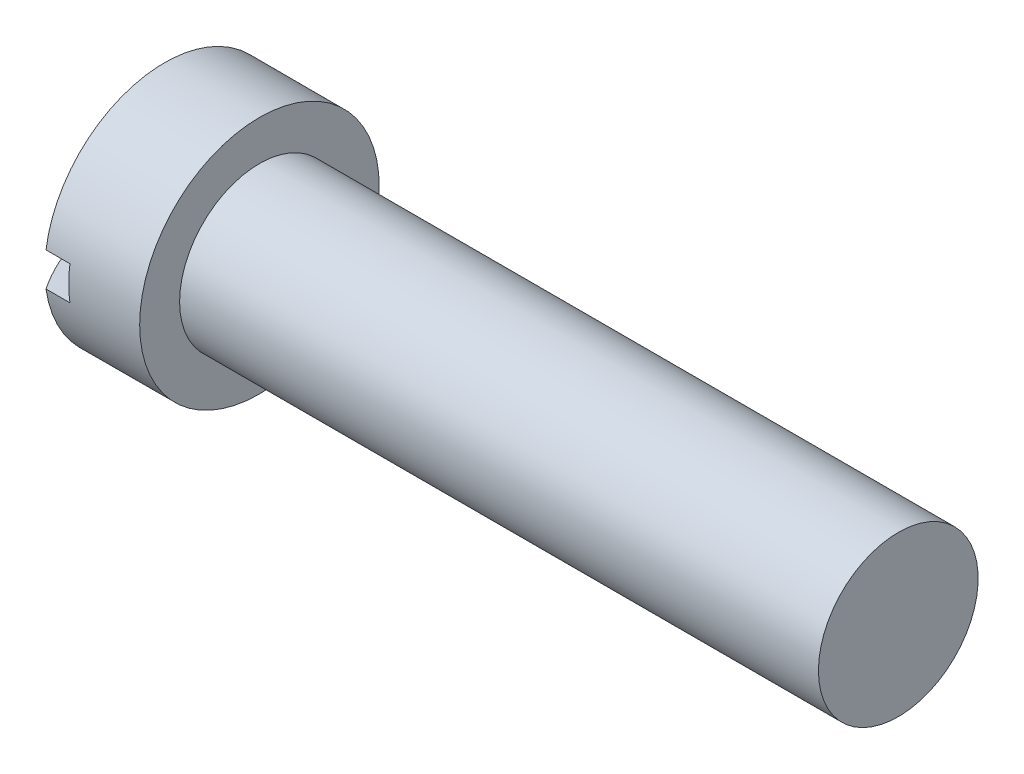
ISO-10303-21;
HEADER;
FILE_DESCRIPTION(('STEP AP214'),'2;1');
FILE_NAME('part.step','',(''),(''),'','','');
FILE_SCHEMA(('AUTOMOTIVE_DESIGN { 1 0 10303 214 1 1 1 1 }'));
ENDSEC;
DATA;
#1=APPLICATION_CONTEXT('core data for automotive mechanical design processes');
#2=APPLICATION_PROTOCOL_DEFINITION('international standard','automotive_design',2000,#1);
#3=PRODUCT_CONTEXT('',#1,'mechanical');
#4=PRODUCT('Part','Part','',(#3));
#5=PRODUCT_RELATED_PRODUCT_CATEGORY('part','',(#4));
#6=PRODUCT_DEFINITION_FORMATION('','',#4);
#7=PRODUCT_DEFINITION_CONTEXT('part definition',#1,'design');
#8=PRODUCT_DEFINITION('design','',#6,#7);
#9=PRODUCT_DEFINITION_SHAPE('','',#8);
#10=(LENGTH_UNIT() NAMED_UNIT(*) SI_UNIT(.MILLI.,.METRE.));
#11=(NAMED_UNIT(*) PLANE_ANGLE_UNIT() SI_UNIT($,.RADIAN.));
#12=(NAMED_UNIT(*) SI_UNIT($,.STERADIAN.) SOLID_ANGLE_UNIT());
#13=UNCERTAINTY_MEASURE_WITH_UNIT(LENGTH_MEASURE(1.E-05),#10,'distance_accuracy_value','');
#14=(GEOMETRIC_REPRESENTATION_CONTEXT(3) GLOBAL_UNCERTAINTY_ASSIGNED_CONTEXT((#13)) GLOBAL_UNIT_ASSIGNED_CONTEXT((#10,
#11,#12)) REPRESENTATION_CONTEXT('',''));
#15=CARTESIAN_POINT('',(0.,0.,0.));
#16=DIRECTION('',(0.,0.,1.));
#17=DIRECTION('',(1.,0.,0.));
#18=AXIS2_PLACEMENT_3D('',#15,#16,#17);
#19=CARTESIAN_POINT('',(16.9903913043478,0.,0.));
#20=DIRECTION('',(-1.,0.,0.));
#21=DIRECTION('',(0.,-1.,0.));
#22=AXIS2_PLACEMENT_3D('',#19,#20,#21);
#23=SPHERICAL_SURFACE('',#22,16.9903913043478);
#24=CARTESIAN_POINT('',(2.921,0.,0.));
#25=DIRECTION('',(-1.,0.,0.));
#26=DIRECTION('',(0.,0.,1.));
#27=AXIS2_PLACEMENT_3D('',#24,#25,#26);
#28=CIRCLE('',#27,9.525);
#29=CARTESIAN_POINT('',(2.921,-1.3462,-9.42938866311067));
#30=VERTEX_POINT('',#29);
#31=CARTESIAN_POINT('',(2.921,-1.3462,9.42938866311067));
#32=VERTEX_POINT('',#31);
#33=EDGE_CURVE('E98',#30,#32,#28,.T.);
#34=ORIENTED_EDGE('',*,*,#33,.T.);
#35=CARTESIAN_POINT('',(16.9903913043478,-1.3462,0.));
#36=DIRECTION('',(0.,1.,0.));
#37=DIRECTION('',(0.,0.,1.));
#38=AXIS2_PLACEMENT_3D('',#35,#36,#37);
#39=CIRCLE('',#38,16.9369755929109);
#40=EDGE_CURVE('E122',#32,#30,#39,.F.);
#41=ORIENTED_EDGE('',*,*,#40,.T.);
#42=EDGE_LOOP('',(#34,#41));
#43=FACE_BOUND('',#42,.T.);
#44=ADVANCED_FACE('F44',(#43),#23,.T.);
#45=CARTESIAN_POINT('',(2.921,1.3462,9.42938866311067));
#46=VERTEX_POINT('',#45);
#47=CARTESIAN_POINT('',(2.921,1.3462,-9.42938866311067));
#48=VERTEX_POINT('',#47);
#49=EDGE_CURVE('E100',#46,#48,#28,.T.);
#50=ORIENTED_EDGE('',*,*,#49,.T.);
#51=CARTESIAN_POINT('',(16.9903913043478,1.3462,0.));
#52=DIRECTION('',(0.,-1.,0.));
#53=DIRECTION('',(0.,0.,-1.));
#54=AXIS2_PLACEMENT_3D('',#51,#52,#53);
#55=CIRCLE('',#54,16.9369755929109);
#56=EDGE_CURVE('E118',#48,#46,#55,.F.);
#57=ORIENTED_EDGE('',*,*,#56,.T.);
#58=EDGE_LOOP('',(#50,#57));
#59=FACE_BOUND('',#58,.T.);
#60=ADVANCED_FACE('F121',(#59),#23,.T.);
#61=CARTESIAN_POINT('',(-25.4,0.,0.));
#62=DIRECTION('',(-1.,0.,0.));
#63=DIRECTION('',(0.,0.,1.));
#64=AXIS2_PLACEMENT_3D('',#61,#62,#63);
#65=CYLINDRICAL_SURFACE('',#64,9.525);
#66=CARTESIAN_POINT('',(10.4648,0.,0.));
#67=DIRECTION('',(-1.,0.,0.));
#68=DIRECTION('',(0.,0.,1.));
#69=AXIS2_PLACEMENT_3D('',#66,#67,#68);
#70=CIRCLE('',#69,9.525);
#71=CARTESIAN_POINT('',(10.4648,0.,9.525));
#72=VERTEX_POINT('',#71);
#73=EDGE_CURVE('E101',#72,#72,#70,.T.);
#74=ORIENTED_EDGE('',*,*,#73,.T.);
#75=EDGE_LOOP('',(#74));
#76=FACE_BOUND('',#75,.T.);
#77=DIRECTION('',(-1.,0.,0.));
#78=VECTOR('',#77,1.);
#79=CARTESIAN_POINT('',(-25.4,-1.3462,-9.42938866311067));
#80=LINE('',#79,#78);
#81=CARTESIAN_POINT('',(4.826,-1.3462,-9.42938866311067));
#82=VERTEX_POINT('',#81);
#83=EDGE_CURVE('E11',#82,#30,#80,.T.);
#84=ORIENTED_EDGE('',*,*,#83,.F.);
#85=CARTESIAN_POINT('',(4.826,0.,0.));
#86=DIRECTION('',(-1.,0.,0.));
#87=DIRECTION('',(0.,0.,1.));
#88=AXIS2_PLACEMENT_3D('',#85,#86,#87);
#89=CIRCLE('',#88,9.525);
#90=CARTESIAN_POINT('',(4.826,1.3462,-9.42938866311067));
#91=VERTEX_POINT('',#90);
#92=EDGE_CURVE('E81',#91,#82,#89,.T.);
#93=ORIENTED_EDGE('',*,*,#92,.F.);
#94=DIRECTION('',(-1.,0.,0.));
#95=VECTOR('',#94,1.);
#96=CARTESIAN_POINT('',(-25.4,1.3462,-9.42938866311067));
#97=LINE('',#96,#95);
#98=EDGE_CURVE('E52',#48,#91,#97,.F.);
#99=ORIENTED_EDGE('',*,*,#98,.F.);
#100=ORIENTED_EDGE('',*,*,#49,.F.);
#101=DIRECTION('',(-1.,0.,0.));
#102=VECTOR('',#101,1.);
#103=CARTESIAN_POINT('',(-25.4,1.3462,9.42938866311067));
#104=LINE('',#103,#102);
#105=CARTESIAN_POINT('',(4.826,1.3462,9.42938866311067));
#106=VERTEX_POINT('',#105);
#107=EDGE_CURVE('E112',#106,#46,#104,.T.);
#108=ORIENTED_EDGE('',*,*,#107,.F.);
#109=CARTESIAN_POINT('',(4.826,-1.3462,9.42938866311067));
#110=VERTEX_POINT('',#109);
#111=EDGE_CURVE('E90',#110,#106,#89,.T.);
#112=ORIENTED_EDGE('',*,*,#111,.F.);
#113=DIRECTION('',(-1.,0.,0.));
#114=VECTOR('',#113,1.);
#115=CARTESIAN_POINT('',(-25.4,-1.3462,9.42938866311067));
#116=LINE('',#115,#114);
#117=EDGE_CURVE('E88',#32,#110,#116,.F.);
#118=ORIENTED_EDGE('',*,*,#117,.F.);
#119=ORIENTED_EDGE('',*,*,#33,.F.);
#120=EDGE_LOOP('',(#84,#93,#99,#100,#108,#112,#118,#119));
#121=FACE_BOUND('',#120,.T.);
#122=ADVANCED_FACE('F96',(#76,#121),#65,.T.);
#123=CARTESIAN_POINT('',(-25.4,0.,0.));
#124=DIRECTION('',(-1.,0.,0.));
#125=DIRECTION('',(0.,0.,1.));
#126=AXIS2_PLACEMENT_3D('',#123,#124,#125);
#127=CYLINDRICAL_SURFACE('',#126,6.35);
#128=CARTESIAN_POINT('',(61.2648,0.,0.));
#129=DIRECTION('',(-1.,0.,0.));
#130=DIRECTION('',(0.,0.,1.));
#131=AXIS2_PLACEMENT_3D('',#128,#129,#130);
#132=CIRCLE('',#131,6.35);
#133=CARTESIAN_POINT('',(61.2648,0.,6.35));
#134=VERTEX_POINT('',#133);
#135=EDGE_CURVE('E104',#134,#134,#132,.T.);
#136=ORIENTED_EDGE('',*,*,#135,.T.);
#137=EDGE_LOOP('',(#136));
#138=FACE_BOUND('',#137,.T.);
#139=CARTESIAN_POINT('',(10.4648,0.,0.));
#140=DIRECTION('',(-1.,0.,0.));
#141=DIRECTION('',(0.,0.,1.));
#142=AXIS2_PLACEMENT_3D('',#139,#140,#141);
#143=CIRCLE('',#142,6.35);
#144=CARTESIAN_POINT('',(10.4648,0.,6.35));
#145=VERTEX_POINT('',#144);
#146=EDGE_CURVE('E106',#145,#145,#143,.T.);
#147=ORIENTED_EDGE('',*,*,#146,.F.);
#148=EDGE_LOOP('',(#147));
#149=FACE_BOUND('',#148,.T.);
#150=ADVANCED_FACE('F46',(#138,#149),#127,.T.);
#151=CARTESIAN_POINT('',(61.2648,6.35,0.));
#152=DIRECTION('',(1.,0.,0.));
#153=DIRECTION('',(0.,0.,-1.));
#154=AXIS2_PLACEMENT_3D('',#151,#152,#153);
#155=PLANE('',#154);
#156=ORIENTED_EDGE('',*,*,#135,.F.);
#157=EDGE_LOOP('',(#156));
#158=FACE_BOUND('',#157,.T.);
#159=ADVANCED_FACE('F132',(#158),#155,.T.);
#160=CARTESIAN_POINT('',(10.4648,6.35,0.));
#161=DIRECTION('',(-1.,0.,0.));
#162=DIRECTION('',(0.,0.,1.));
#163=AXIS2_PLACEMENT_3D('',#160,#161,#162);
#164=PLANE('',#163);
#165=ORIENTED_EDGE('',*,*,#73,.F.);
#166=EDGE_LOOP('',(#165));
#167=FACE_BOUND('',#166,.T.);
#168=ORIENTED_EDGE('',*,*,#146,.T.);
#169=EDGE_LOOP('',(#168));
#170=FACE_BOUND('',#169,.T.);
#171=ADVANCED_FACE('F129',(#167,#170),#164,.F.);
#172=CARTESIAN_POINT('',(4.826,-1.3462,-9.525));
#173=DIRECTION('',(0.,1.,0.));
#174=DIRECTION('',(0.,0.,1.));
#175=AXIS2_PLACEMENT_3D('',#172,#173,#174);
#176=PLANE('',#175);
#177=ORIENTED_EDGE('',*,*,#83,.T.);
#178=ORIENTED_EDGE('',*,*,#40,.F.);
#179=ORIENTED_EDGE('',*,*,#117,.T.);
#180=DIRECTION('',(0.,0.,-1.));
#181=VECTOR('',#180,1.);
#182=CARTESIAN_POINT('',(4.826,-1.3462,-9.525));
#183=LINE('',#182,#181);
#184=EDGE_CURVE('E59',#110,#82,#183,.T.);
#185=ORIENTED_EDGE('',*,*,#184,.T.);
#186=EDGE_LOOP('',(#177,#178,#179,#185));
#187=FACE_BOUND('',#186,.T.);
#188=ADVANCED_FACE('F91',(#187),#176,.T.);
#189=CARTESIAN_POINT('',(4.826,1.3462,9.525));
#190=DIRECTION('',(0.,-1.,0.));
#191=DIRECTION('',(0.,0.,-1.));
#192=AXIS2_PLACEMENT_3D('',#189,#190,#191);
#193=PLANE('',#192);
#194=ORIENTED_EDGE('',*,*,#107,.T.);
#195=ORIENTED_EDGE('',*,*,#56,.F.);
#196=ORIENTED_EDGE('',*,*,#98,.T.);
#197=DIRECTION('',(0.,0.,1.));
#198=VECTOR('',#197,1.);
#199=CARTESIAN_POINT('',(4.826,1.3462,9.525));
#200=LINE('',#199,#198);
#201=EDGE_CURVE('E84',#91,#106,#200,.T.);
#202=ORIENTED_EDGE('',*,*,#201,.T.);
#203=EDGE_LOOP('',(#194,#195,#196,#202));
#204=FACE_BOUND('',#203,.T.);
#205=ADVANCED_FACE('F115',(#204),#193,.T.);
#206=CARTESIAN_POINT('',(4.826,-1.3462,9.525));
#207=DIRECTION('',(-1.,0.,0.));
#208=DIRECTION('',(0.,0.,1.));
#209=AXIS2_PLACEMENT_3D('',#206,#207,#208);
#210=PLANE('',#209);
#211=ORIENTED_EDGE('',*,*,#201,.F.);
#212=ORIENTED_EDGE('',*,*,#92,.T.);
#213=ORIENTED_EDGE('',*,*,#184,.F.);
#214=ORIENTED_EDGE('',*,*,#111,.T.);
#215=EDGE_LOOP('',(#211,#212,#213,#214));
#216=FACE_BOUND('',#215,.T.);
#217=ADVANCED_FACE('F82',(#216),#210,.T.);
#218=CLOSED_SHELL('',(#44,#60,#122,#150,#159,#171,#188,#205,#217));
#219=MANIFOLD_SOLID_BREP('B2',#218);
#220=ADVANCED_BREP_SHAPE_REPRESENTATION('',(#18,#219),#14);
#221=SHAPE_DEFINITION_REPRESENTATION(#9,#220);
ENDSEC;
END-ISO-10303-21;
